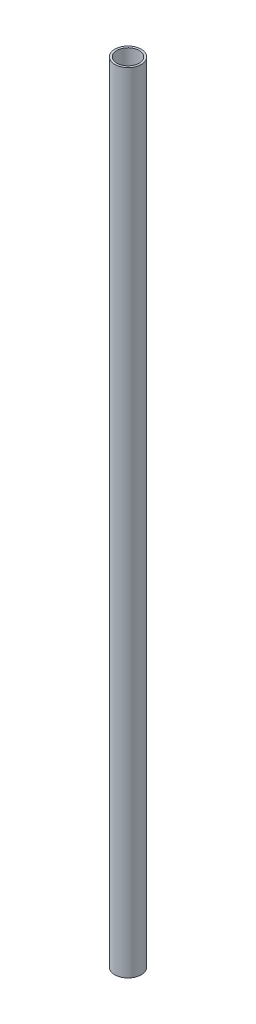
ISO-10303-21;
HEADER;
FILE_DESCRIPTION(('STEP AP214'),'2;1');
FILE_NAME('part.step','',(''),(''),'','','');
FILE_SCHEMA(('AUTOMOTIVE_DESIGN { 1 0 10303 214 1 1 1 1 }'));
ENDSEC;
DATA;
#1=APPLICATION_CONTEXT('core data for automotive mechanical design processes');
#2=APPLICATION_PROTOCOL_DEFINITION('international standard','automotive_design',2000,#1);
#3=PRODUCT_CONTEXT('',#1,'mechanical');
#4=PRODUCT('Part','Part','',(#3));
#5=PRODUCT_RELATED_PRODUCT_CATEGORY('part','',(#4));
#6=PRODUCT_DEFINITION_FORMATION('','',#4);
#7=PRODUCT_DEFINITION_CONTEXT('part definition',#1,'design');
#8=PRODUCT_DEFINITION('design','',#6,#7);
#9=PRODUCT_DEFINITION_SHAPE('','',#8);
#10=(LENGTH_UNIT() NAMED_UNIT(*) SI_UNIT(.MILLI.,.METRE.));
#11=(NAMED_UNIT(*) PLANE_ANGLE_UNIT() SI_UNIT($,.RADIAN.));
#12=(NAMED_UNIT(*) SI_UNIT($,.STERADIAN.) SOLID_ANGLE_UNIT());
#13=UNCERTAINTY_MEASURE_WITH_UNIT(LENGTH_MEASURE(1.E-05),#10,'distance_accuracy_value','');
#14=(GEOMETRIC_REPRESENTATION_CONTEXT(3) GLOBAL_UNCERTAINTY_ASSIGNED_CONTEXT((#13)) GLOBAL_UNIT_ASSIGNED_CONTEXT((#10,
#11,#12)) REPRESENTATION_CONTEXT('',''));
#15=CARTESIAN_POINT('',(0.,0.,0.));
#16=DIRECTION('',(0.,0.,1.));
#17=DIRECTION('',(1.,0.,0.));
#18=AXIS2_PLACEMENT_3D('',#15,#16,#17);
#19=CARTESIAN_POINT('',(0.,441.,0.));
#20=DIRECTION('',(0.,1.,0.));
#21=DIRECTION('',(0.,0.,1.));
#22=AXIS2_PLACEMENT_3D('',#19,#20,#21);
#23=PLANE('',#22);
#24=CARTESIAN_POINT('',(0.,441.,0.));
#25=DIRECTION('',(0.,1.,0.));
#26=DIRECTION('',(0.,0.,1.));
#27=AXIS2_PLACEMENT_3D('',#24,#25,#26);
#28=CIRCLE('',#27,7.75);
#29=CARTESIAN_POINT('',(0.,441.,-7.75));
#30=VERTEX_POINT('',#29);
#31=EDGE_CURVE('E10',#30,#30,#28,.T.);
#32=ORIENTED_EDGE('',*,*,#31,.T.);
#33=EDGE_LOOP('',(#32));
#34=FACE_BOUND('',#33,.T.);
#35=CARTESIAN_POINT('',(0.,441.,0.));
#36=DIRECTION('',(0.,1.,0.));
#37=DIRECTION('',(0.,0.,1.));
#38=AXIS2_PLACEMENT_3D('',#35,#36,#37);
#39=CIRCLE('',#38,6.5);
#40=CARTESIAN_POINT('',(0.,441.,-6.5));
#41=VERTEX_POINT('',#40);
#42=EDGE_CURVE('E38',#41,#41,#39,.T.);
#43=ORIENTED_EDGE('',*,*,#42,.F.);
#44=EDGE_LOOP('',(#43));
#45=FACE_BOUND('',#44,.T.);
#46=ADVANCED_FACE('F31',(#34,#45),#23,.T.);
#47=CARTESIAN_POINT('',(0.,441.,0.));
#48=DIRECTION('',(0.,-1.,0.));
#49=DIRECTION('',(0.,0.,-1.));
#50=AXIS2_PLACEMENT_3D('',#47,#48,#49);
#51=CYLINDRICAL_SURFACE('',#50,7.75);
#52=CARTESIAN_POINT('',(0.,-20.4764296628904,0.));
#53=DIRECTION('',(0.,1.,0.));
#54=DIRECTION('',(0.,0.,1.));
#55=AXIS2_PLACEMENT_3D('',#52,#53,#54);
#56=CIRCLE('',#55,7.75);
#57=CARTESIAN_POINT('',(0.,-20.4764296628904,-7.75));
#58=VERTEX_POINT('',#57);
#59=EDGE_CURVE('E42',#58,#58,#56,.T.);
#60=CARTESIAN_POINT('',(0.,441.,-7.75));
#61=CARTESIAN_POINT('',(0.,436.192953857679,-7.75));
#62=CARTESIAN_POINT('',(0.,431.385907715357,-7.75));
#63=CARTESIAN_POINT('',(0.,421.771815430713,-7.75));
#64=CARTESIAN_POINT('',(0.,416.964769288391,-7.75));
#65=CARTESIAN_POINT('',(0.,407.350677003748,-7.75));
#66=CARTESIAN_POINT('',(0.,402.543630861426,-7.75));
#67=CARTESIAN_POINT('',(0.,392.929538576782,-7.75));
#68=CARTESIAN_POINT('',(0.,388.122492434461,-7.75));
#69=CARTESIAN_POINT('',(0.,378.508400149817,-7.75));
#70=CARTESIAN_POINT('',(0.,373.701354007495,-7.75));
#71=CARTESIAN_POINT('',(0.,364.087261722852,-7.75));
#72=CARTESIAN_POINT('',(0.,359.28021558053,-7.75));
#73=CARTESIAN_POINT('',(0.,349.666123295886,-7.75));
#74=CARTESIAN_POINT('',(0.,344.859077153565,-7.75));
#75=CARTESIAN_POINT('',(0.,335.244984868921,-7.75));
#76=CARTESIAN_POINT('',(0.,330.437938726599,-7.75));
#77=CARTESIAN_POINT('',(0.,320.823846441956,-7.75));
#78=CARTESIAN_POINT('',(0.,316.016800299634,-7.75));
#79=CARTESIAN_POINT('',(0.,306.40270801499,-7.75));
#80=CARTESIAN_POINT('',(0.,301.595661872669,-7.75));
#81=CARTESIAN_POINT('',(0.,291.981569588025,-7.75));
#82=CARTESIAN_POINT('',(0.,287.174523445703,-7.75));
#83=CARTESIAN_POINT('',(0.,277.56043116106,-7.75));
#84=CARTESIAN_POINT('',(0.,272.753385018738,-7.75));
#85=CARTESIAN_POINT('',(0.,263.139292734094,-7.75));
#86=CARTESIAN_POINT('',(0.,258.332246591773,-7.75));
#87=CARTESIAN_POINT('',(0.,248.718154307129,-7.75));
#88=CARTESIAN_POINT('',(0.,243.911108164807,-7.75));
#89=CARTESIAN_POINT('',(0.,234.297015880164,-7.75));
#90=CARTESIAN_POINT('',(0.,229.489969737842,-7.75));
#91=CARTESIAN_POINT('',(0.,219.875877453198,-7.75));
#92=CARTESIAN_POINT('',(0.,215.068831310877,-7.75));
#93=CARTESIAN_POINT('',(0.,205.454739026233,-7.75));
#94=CARTESIAN_POINT('',(0.,200.647692883911,-7.75));
#95=CARTESIAN_POINT('',(0.,191.033600599268,-7.75));
#96=CARTESIAN_POINT('',(0.,186.226554456946,-7.75));
#97=CARTESIAN_POINT('',(0.,176.612462172303,-7.75));
#98=CARTESIAN_POINT('',(0.,171.805416029981,-7.75));
#99=CARTESIAN_POINT('',(0.,162.191323745337,-7.75));
#100=CARTESIAN_POINT('',(0.,157.384277603015,-7.75));
#101=CARTESIAN_POINT('',(0.,147.770185318372,-7.75));
#102=CARTESIAN_POINT('',(0.,142.96313917605,-7.75));
#103=CARTESIAN_POINT('',(0.,133.349046891407,-7.75));
#104=CARTESIAN_POINT('',(0.,128.542000749085,-7.75));
#105=CARTESIAN_POINT('',(0.,118.927908464441,-7.75));
#106=CARTESIAN_POINT('',(0.,114.120862322119,-7.75));
#107=CARTESIAN_POINT('',(0.,104.506770037476,-7.75));
#108=CARTESIAN_POINT('',(0.,99.699723895154,-7.75));
#109=CARTESIAN_POINT('',(0.,90.0856316105105,-7.75));
#110=CARTESIAN_POINT('',(0.,85.2785854681887,-7.75));
#111=CARTESIAN_POINT('',(0.,75.6644931835451,-7.75));
#112=CARTESIAN_POINT('',(0.,70.8574470412234,-7.75));
#113=CARTESIAN_POINT('',(0.,61.2433547565798,-7.75));
#114=CARTESIAN_POINT('',(0.,56.436308614258,-7.75));
#115=CARTESIAN_POINT('',(0.,46.8222163296145,-7.75));
#116=CARTESIAN_POINT('',(0.,42.0151701872927,-7.75));
#117=CARTESIAN_POINT('',(0.,32.4010779026491,-7.75));
#118=CARTESIAN_POINT('',(0.,27.5940317603274,-7.75));
#119=CARTESIAN_POINT('',(0.,17.9799394756838,-7.75));
#120=CARTESIAN_POINT('',(0.,13.172893333362,-7.75));
#121=CARTESIAN_POINT('',(0.,3.55880104871846,-7.75));
#122=CARTESIAN_POINT('',(0.,-1.24824509360331,-7.75));
#123=CARTESIAN_POINT('',(0.,-10.8623373782469,-7.75));
#124=CARTESIAN_POINT('',(0.,-15.6693835205686,-7.75));
#125=CARTESIAN_POINT('',(0.,-20.4764296628904,-7.75));
#126=B_SPLINE_CURVE_WITH_KNOTS('',3,(#60,#61,#62,#63,#64,#65,#66,#67,#68,#69,#70,#71,#72,#73,
#74,#75,#76,#77,#78,#79,#80,#81,#82,#83,#84,#85,#86,#87,#88,#89,#90,#91,#92,#93,#94,#95,#96,#97,
#98,#99,#100,#101,#102,#103,#104,#105,#106,#107,#108,#109,#110,#111,#112,#113,#114,#115,#116,
#117,#118,#119,#120,#121,#122,#123,#124,#125),.UNSPECIFIED.,.F.,.F.,(4,2,2,2,2,2,2,2,2,2,2,2,2,
2,2,2,2,2,2,2,2,2,2,2,2,2,2,2,2,2,2,2,4),(0.,14.4211384269654,28.8422768539307,43.263415280896,
57.6845537078614,72.1056921348267,86.526830561792,100.947968988757,115.369107415723,
129.790245842688,144.211384269653,158.632522696619,173.053661123584,187.474799550549,
201.895937977515,216.31707640448,230.738214831445,245.159353258411,259.580491685376,
274.001630112341,288.422768539307,302.843906966272,317.265045393237,331.686183820203,
346.107322247168,360.528460674133,374.949599101099,389.370737528064,403.791875955029,
418.213014381995,432.63415280896,447.055291235925,461.476429662891),.UNSPECIFIED.);
#127=EDGE_CURVE('BSEAM33',#30,#58,#126,.T.);
#128=ORIENTED_EDGE('',*,*,#31,.F.);
#129=ORIENTED_EDGE('',*,*,#59,.T.);
#130=ORIENTED_EDGE('',*,*,#127,.T.);
#131=ORIENTED_EDGE('',*,*,#127,.F.);
#132=EDGE_LOOP('',(#128,#130,#129,#131));
#133=FACE_BOUND('',#132,.T.);
#134=ADVANCED_FACE('F33',(#133),#51,.T.);
#135=CARTESIAN_POINT('',(0.,441.,0.));
#136=DIRECTION('',(0.,-1.,0.));
#137=DIRECTION('',(0.,0.,-1.));
#138=AXIS2_PLACEMENT_3D('',#135,#136,#137);
#139=CYLINDRICAL_SURFACE('',#138,6.5);
#140=CARTESIAN_POINT('',(0.,-20.4764296628904,0.));
#141=DIRECTION('',(0.,1.,0.));
#142=DIRECTION('',(0.,0.,1.));
#143=AXIS2_PLACEMENT_3D('',#140,#141,#142);
#144=CIRCLE('',#143,6.5);
#145=CARTESIAN_POINT('',(0.,-20.4764296628904,-6.5));
#146=VERTEX_POINT('',#145);
#147=EDGE_CURVE('E46',#146,#146,#144,.T.);
#148=CARTESIAN_POINT('',(0.,441.,-6.5));
#149=CARTESIAN_POINT('',(0.,436.192953857678,-6.5));
#150=CARTESIAN_POINT('',(0.,431.385907715357,-6.5));
#151=CARTESIAN_POINT('',(0.,421.771815430713,-6.5));
#152=CARTESIAN_POINT('',(0.,416.964769288391,-6.5));
#153=CARTESIAN_POINT('',(0.,407.350677003748,-6.5));
#154=CARTESIAN_POINT('',(0.,402.543630861426,-6.5));
#155=CARTESIAN_POINT('',(0.,392.929538576782,-6.5));
#156=CARTESIAN_POINT('',(0.,388.122492434461,-6.5));
#157=CARTESIAN_POINT('',(0.,378.508400149817,-6.5));
#158=CARTESIAN_POINT('',(0.,373.701354007495,-6.5));
#159=CARTESIAN_POINT('',(0.,364.087261722852,-6.5));
#160=CARTESIAN_POINT('',(0.,359.28021558053,-6.5));
#161=CARTESIAN_POINT('',(0.,349.666123295886,-6.5));
#162=CARTESIAN_POINT('',(0.,344.859077153565,-6.5));
#163=CARTESIAN_POINT('',(0.,335.244984868921,-6.5));
#164=CARTESIAN_POINT('',(0.,330.437938726599,-6.5));
#165=CARTESIAN_POINT('',(0.,320.823846441956,-6.5));
#166=CARTESIAN_POINT('',(0.,316.016800299634,-6.5));
#167=CARTESIAN_POINT('',(0.,306.40270801499,-6.5));
#168=CARTESIAN_POINT('',(0.,301.595661872669,-6.5));
#169=CARTESIAN_POINT('',(0.,291.981569588025,-6.5));
#170=CARTESIAN_POINT('',(0.,287.174523445703,-6.5));
#171=CARTESIAN_POINT('',(0.,277.56043116106,-6.5));
#172=CARTESIAN_POINT('',(0.,272.753385018738,-6.5));
#173=CARTESIAN_POINT('',(0.,263.139292734094,-6.5));
#174=CARTESIAN_POINT('',(0.,258.332246591773,-6.5));
#175=CARTESIAN_POINT('',(0.,248.718154307129,-6.5));
#176=CARTESIAN_POINT('',(0.,243.911108164807,-6.5));
#177=CARTESIAN_POINT('',(0.,234.297015880164,-6.5));
#178=CARTESIAN_POINT('',(0.,229.489969737842,-6.5));
#179=CARTESIAN_POINT('',(0.,219.875877453198,-6.5));
#180=CARTESIAN_POINT('',(0.,215.068831310877,-6.5));
#181=CARTESIAN_POINT('',(0.,205.454739026233,-6.5));
#182=CARTESIAN_POINT('',(0.,200.647692883911,-6.5));
#183=CARTESIAN_POINT('',(0.,191.033600599268,-6.5));
#184=CARTESIAN_POINT('',(0.,186.226554456946,-6.5));
#185=CARTESIAN_POINT('',(0.,176.612462172302,-6.5));
#186=CARTESIAN_POINT('',(0.,171.805416029981,-6.5));
#187=CARTESIAN_POINT('',(0.,162.191323745337,-6.5));
#188=CARTESIAN_POINT('',(0.,157.384277603015,-6.5));
#189=CARTESIAN_POINT('',(0.,147.770185318372,-6.5));
#190=CARTESIAN_POINT('',(0.,142.96313917605,-6.5));
#191=CARTESIAN_POINT('',(0.,133.349046891406,-6.5));
#192=CARTESIAN_POINT('',(0.,128.542000749085,-6.5));
#193=CARTESIAN_POINT('',(0.,118.927908464441,-6.5));
#194=CARTESIAN_POINT('',(0.,114.120862322119,-6.5));
#195=CARTESIAN_POINT('',(0.,104.506770037476,-6.5));
#196=CARTESIAN_POINT('',(0.,99.699723895154,-6.5));
#197=CARTESIAN_POINT('',(0.,90.0856316105105,-6.5));
#198=CARTESIAN_POINT('',(0.,85.2785854681887,-6.5));
#199=CARTESIAN_POINT('',(0.,75.6644931835451,-6.5));
#200=CARTESIAN_POINT('',(0.,70.8574470412234,-6.5));
#201=CARTESIAN_POINT('',(0.,61.2433547565798,-6.5));
#202=CARTESIAN_POINT('',(0.,56.436308614258,-6.5));
#203=CARTESIAN_POINT('',(0.,46.8222163296145,-6.5));
#204=CARTESIAN_POINT('',(0.,42.0151701872927,-6.5));
#205=CARTESIAN_POINT('',(0.,32.4010779026491,-6.5));
#206=CARTESIAN_POINT('',(0.,27.5940317603274,-6.5));
#207=CARTESIAN_POINT('',(0.,17.9799394756838,-6.5));
#208=CARTESIAN_POINT('',(0.,13.172893333362,-6.5));
#209=CARTESIAN_POINT('',(0.,3.55880104871846,-6.5));
#210=CARTESIAN_POINT('',(0.,-1.24824509360331,-6.5));
#211=CARTESIAN_POINT('',(0.,-10.8623373782469,-6.5));
#212=CARTESIAN_POINT('',(0.,-15.6693835205686,-6.5));
#213=CARTESIAN_POINT('',(0.,-20.4764296628904,-6.5));
#214=B_SPLINE_CURVE_WITH_KNOTS('',3,(#148,#149,#150,#151,#152,#153,#154,#155,#156,#157,#158,
#159,#160,#161,#162,#163,#164,#165,#166,#167,#168,#169,#170,#171,#172,#173,#174,#175,#176,#177,
#178,#179,#180,#181,#182,#183,#184,#185,#186,#187,#188,#189,#190,#191,#192,#193,#194,#195,#196,
#197,#198,#199,#200,#201,#202,#203,#204,#205,#206,#207,#208,#209,#210,#211,#212,#213),
.UNSPECIFIED.,.F.,.F.,(4,2,2,2,2,2,2,2,2,2,2,2,2,2,2,2,2,2,2,2,2,2,2,2,2,2,2,2,2,2,2,2,4),(0.,
14.4211384269653,28.8422768539306,43.2634152808959,57.6845537078613,72.1056921348267,
86.5268305617919,100.947968988757,115.369107415723,129.790245842688,144.211384269653,
158.632522696619,173.053661123584,187.474799550549,201.895937977515,216.31707640448,
230.738214831445,245.159353258411,259.580491685376,274.001630112341,288.422768539307,
302.843906966272,317.265045393237,331.686183820203,346.107322247168,360.528460674133,
374.949599101099,389.370737528064,403.791875955029,418.213014381995,432.63415280896,
447.055291235925,461.476429662891),.UNSPECIFIED.);
#215=EDGE_CURVE('BSEAM55',#41,#146,#214,.T.);
#216=ORIENTED_EDGE('',*,*,#42,.T.);
#217=ORIENTED_EDGE('',*,*,#147,.F.);
#218=ORIENTED_EDGE('',*,*,#215,.T.);
#219=ORIENTED_EDGE('',*,*,#215,.F.);
#220=EDGE_LOOP('',(#216,#218,#217,#219));
#221=FACE_BOUND('',#220,.T.);
#222=ADVANCED_FACE('F55',(#221),#139,.F.);
#223=CARTESIAN_POINT('',(0.,-20.4764296628904,0.));
#224=DIRECTION('',(0.,1.,0.));
#225=DIRECTION('',(0.,0.,1.));
#226=AXIS2_PLACEMENT_3D('',#223,#224,#225);
#227=PLANE('',#226);
#228=ORIENTED_EDGE('',*,*,#147,.T.);
#229=EDGE_LOOP('',(#228));
#230=FACE_BOUND('',#229,.T.);
#231=ORIENTED_EDGE('',*,*,#59,.F.);
#232=EDGE_LOOP('',(#231));
#233=FACE_BOUND('',#232,.T.);
#234=ADVANCED_FACE('F52',(#230,#233),#227,.F.);
#235=CLOSED_SHELL('',(#46,#134,#222,#234));
#236=MANIFOLD_SOLID_BREP('B2',#235);
#237=ADVANCED_BREP_SHAPE_REPRESENTATION('',(#18,#236),#14);
#238=SHAPE_DEFINITION_REPRESENTATION(#9,#237);
ENDSEC;
END-ISO-10303-21;
